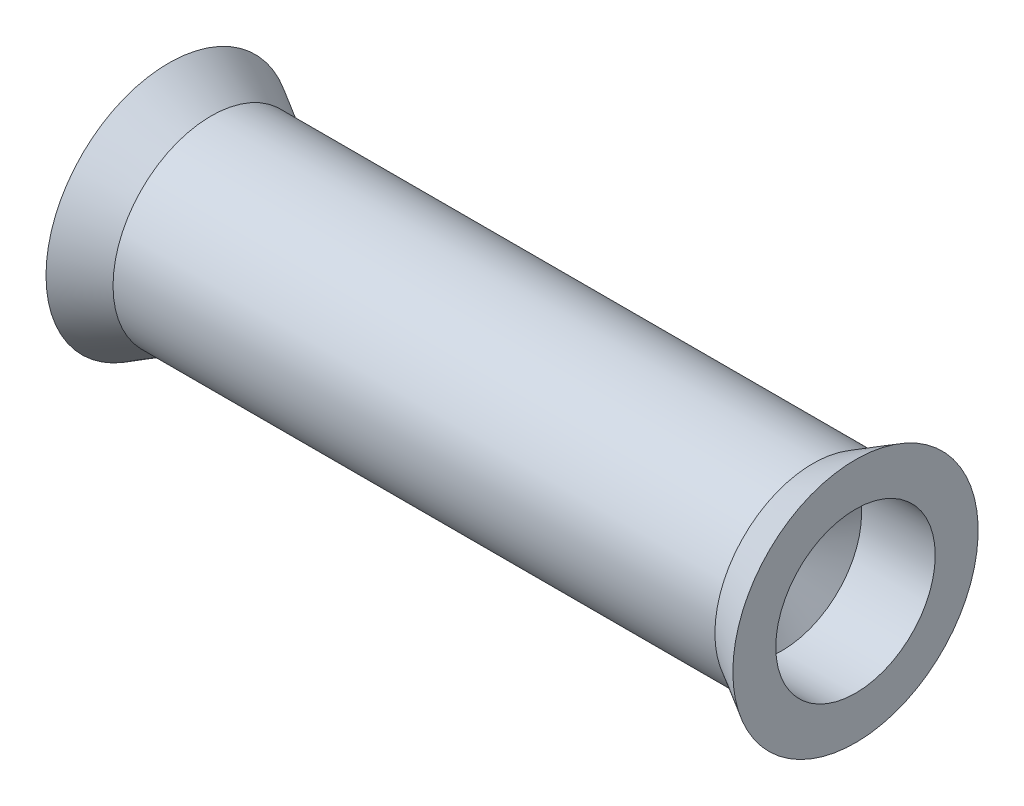
ISO-10303-21;
HEADER;
FILE_DESCRIPTION(('STEP AP214'),'2;1');
FILE_NAME('part.step','',(''),(''),'','','');
FILE_SCHEMA(('AUTOMOTIVE_DESIGN { 1 0 10303 214 1 1 1 1 }'));
ENDSEC;
DATA;
#1=APPLICATION_CONTEXT('core data for automotive mechanical design processes');
#2=APPLICATION_PROTOCOL_DEFINITION('international standard','automotive_design',2000,#1);
#3=PRODUCT_CONTEXT('',#1,'mechanical');
#4=PRODUCT('Part','Part','',(#3));
#5=PRODUCT_RELATED_PRODUCT_CATEGORY('part','',(#4));
#6=PRODUCT_DEFINITION_FORMATION('','',#4);
#7=PRODUCT_DEFINITION_CONTEXT('part definition',#1,'design');
#8=PRODUCT_DEFINITION('design','',#6,#7);
#9=PRODUCT_DEFINITION_SHAPE('','',#8);
#10=(LENGTH_UNIT() NAMED_UNIT(*) SI_UNIT(.MILLI.,.METRE.));
#11=(NAMED_UNIT(*) PLANE_ANGLE_UNIT() SI_UNIT($,.RADIAN.));
#12=(NAMED_UNIT(*) SI_UNIT($,.STERADIAN.) SOLID_ANGLE_UNIT());
#13=UNCERTAINTY_MEASURE_WITH_UNIT(LENGTH_MEASURE(1.E-05),#10,'distance_accuracy_value','');
#14=(GEOMETRIC_REPRESENTATION_CONTEXT(3) GLOBAL_UNCERTAINTY_ASSIGNED_CONTEXT((#13)) GLOBAL_UNIT_ASSIGNED_CONTEXT((#10,
#11,#12)) REPRESENTATION_CONTEXT('',''));
#15=CARTESIAN_POINT('',(0.,0.,0.));
#16=DIRECTION('',(0.,0.,1.));
#17=DIRECTION('',(1.,0.,0.));
#18=AXIS2_PLACEMENT_3D('',#15,#16,#17);
#19=CARTESIAN_POINT('',(-30.,0.,0.));
#20=DIRECTION('',(-1.,0.,0.));
#21=DIRECTION('',(0.,0.,1.));
#22=AXIS2_PLACEMENT_3D('',#19,#20,#21);
#23=CYLINDRICAL_SURFACE('',#22,4.);
#24=CARTESIAN_POINT('',(-12.2679491924311,0.,0.));
#25=DIRECTION('',(-1.,0.,0.));
#26=DIRECTION('',(0.,0.,1.));
#27=AXIS2_PLACEMENT_3D('',#24,#25,#26);
#28=CIRCLE('',#27,4.);
#29=CARTESIAN_POINT('',(-12.2679491924311,0.,4.));
#30=VERTEX_POINT('',#29);
#31=EDGE_CURVE('E54',#30,#30,#28,.T.);
#32=ORIENTED_EDGE('',*,*,#31,.F.);
#33=EDGE_LOOP('',(#32));
#34=FACE_BOUND('',#33,.T.);
#35=CARTESIAN_POINT('',(12.2679491924311,0.,0.));
#36=DIRECTION('',(1.,0.,0.));
#37=DIRECTION('',(0.,0.,-1.));
#38=AXIS2_PLACEMENT_3D('',#35,#36,#37);
#39=CIRCLE('',#38,4.);
#40=CARTESIAN_POINT('',(12.2679491924311,0.,-4.));
#41=VERTEX_POINT('',#40);
#42=EDGE_CURVE('E11',#41,#41,#39,.T.);
#43=ORIENTED_EDGE('',*,*,#42,.F.);
#44=EDGE_LOOP('',(#43));
#45=FACE_BOUND('',#44,.T.);
#46=ADVANCED_FACE('F45',(#34,#45),#23,.T.);
#47=CARTESIAN_POINT('',(-12.2679491924311,0.,0.));
#48=DIRECTION('',(-1.,0.,0.));
#49=DIRECTION('',(0.,0.,1.));
#50=AXIS2_PLACEMENT_3D('',#47,#48,#49);
#51=CONICAL_SURFACE('',#50,4.,0.5235987755983);
#52=CARTESIAN_POINT('',(-14.,0.,0.));
#53=DIRECTION('',(-1.,0.,0.));
#54=DIRECTION('',(0.,0.,1.));
#55=AXIS2_PLACEMENT_3D('',#52,#53,#54);
#56=CIRCLE('',#55,5.);
#57=CARTESIAN_POINT('',(-14.,0.,5.));
#58=VERTEX_POINT('',#57);
#59=EDGE_CURVE('E84',#58,#58,#56,.T.);
#60=ORIENTED_EDGE('',*,*,#59,.F.);
#61=EDGE_LOOP('',(#60));
#62=FACE_BOUND('',#61,.T.);
#63=ORIENTED_EDGE('',*,*,#31,.T.);
#64=EDGE_LOOP('',(#63));
#65=FACE_BOUND('',#64,.T.);
#66=ADVANCED_FACE('F113',(#62,#65),#51,.T.);
#67=CARTESIAN_POINT('',(-14.,0.,0.));
#68=DIRECTION('',(-1.,0.,0.));
#69=DIRECTION('',(0.,0.,1.));
#70=AXIS2_PLACEMENT_3D('',#67,#68,#69);
#71=PLANE('',#70);
#72=CARTESIAN_POINT('',(-14.,0.,0.));
#73=DIRECTION('',(-1.,0.,0.));
#74=DIRECTION('',(0.,0.,1.));
#75=AXIS2_PLACEMENT_3D('',#72,#73,#74);
#76=CIRCLE('',#75,3.25);
#77=CARTESIAN_POINT('',(-14.,0.,3.25));
#78=VERTEX_POINT('',#77);
#79=EDGE_CURVE('E79',#78,#78,#76,.F.);
#80=ORIENTED_EDGE('',*,*,#79,.T.);
#81=EDGE_LOOP('',(#80));
#82=FACE_BOUND('',#81,.T.);
#83=ORIENTED_EDGE('',*,*,#59,.T.);
#84=EDGE_LOOP('',(#83));
#85=FACE_BOUND('',#84,.T.);
#86=ADVANCED_FACE('F94',(#82,#85),#71,.T.);
#87=CARTESIAN_POINT('',(14.,0.,0.));
#88=DIRECTION('',(1.,0.,0.));
#89=DIRECTION('',(0.,0.,-1.));
#90=AXIS2_PLACEMENT_3D('',#87,#88,#89);
#91=CONICAL_SURFACE('',#90,5.,0.5235987755983);
#92=ORIENTED_EDGE('',*,*,#42,.T.);
#93=EDGE_LOOP('',(#92));
#94=FACE_BOUND('',#93,.T.);
#95=CARTESIAN_POINT('',(14.,0.,0.));
#96=DIRECTION('',(-1.,0.,0.));
#97=DIRECTION('',(0.,0.,1.));
#98=AXIS2_PLACEMENT_3D('',#95,#96,#97);
#99=CIRCLE('',#98,5.);
#100=CARTESIAN_POINT('',(14.,0.,5.));
#101=VERTEX_POINT('',#100);
#102=EDGE_CURVE('E80',#101,#101,#99,.T.);
#103=ORIENTED_EDGE('',*,*,#102,.T.);
#104=EDGE_LOOP('',(#103));
#105=FACE_BOUND('',#104,.T.);
#106=ADVANCED_FACE('F124',(#94,#105),#91,.T.);
#107=CARTESIAN_POINT('',(14.,0.,0.));
#108=DIRECTION('',(1.,0.,0.));
#109=DIRECTION('',(0.,0.,-1.));
#110=AXIS2_PLACEMENT_3D('',#107,#108,#109);
#111=PLANE('',#110);
#112=CARTESIAN_POINT('',(14.,0.,0.));
#113=DIRECTION('',(1.,0.,0.));
#114=DIRECTION('',(0.,0.,-1.));
#115=AXIS2_PLACEMENT_3D('',#112,#113,#114);
#116=CIRCLE('',#115,3.25);
#117=CARTESIAN_POINT('',(14.,0.,-3.25));
#118=VERTEX_POINT('',#117);
#119=EDGE_CURVE('E48',#118,#118,#116,.F.);
#120=ORIENTED_EDGE('',*,*,#119,.T.);
#121=EDGE_LOOP('',(#120));
#122=FACE_BOUND('',#121,.T.);
#123=ORIENTED_EDGE('',*,*,#102,.F.);
#124=EDGE_LOOP('',(#123));
#125=FACE_BOUND('',#124,.T.);
#126=ADVANCED_FACE('F101',(#122,#125),#111,.T.);
#127=CARTESIAN_POINT('',(-22.,0.,0.));
#128=DIRECTION('',(-1.,0.,0.));
#129=DIRECTION('',(0.,0.,1.));
#130=AXIS2_PLACEMENT_3D('',#127,#128,#129);
#131=CYLINDRICAL_SURFACE('',#130,3.25);
#132=ORIENTED_EDGE('',*,*,#79,.F.);
#133=EDGE_LOOP('',(#132));
#134=FACE_BOUND('',#133,.T.);
#135=CARTESIAN_POINT('',(-11.,0.,0.));
#136=DIRECTION('',(-1.,0.,0.));
#137=DIRECTION('',(0.,0.,1.));
#138=AXIS2_PLACEMENT_3D('',#135,#136,#137);
#139=CIRCLE('',#138,3.25);
#140=CARTESIAN_POINT('',(-11.,0.,3.25));
#141=VERTEX_POINT('',#140);
#142=EDGE_CURVE('E74',#141,#141,#139,.T.);
#143=ORIENTED_EDGE('',*,*,#142,.F.);
#144=EDGE_LOOP('',(#143));
#145=FACE_BOUND('',#144,.T.);
#146=ADVANCED_FACE('F97',(#134,#145),#131,.F.);
#147=CARTESIAN_POINT('',(-9.12361162513373,0.,0.));
#148=DIRECTION('',(-1.,0.,0.));
#149=DIRECTION('',(0.,0.,1.));
#150=AXIS2_PLACEMENT_3D('',#147,#148,#149);
#151=CONICAL_SURFACE('',#150,0.,1.0471975511966);
#152=ORIENTED_EDGE('',*,*,#142,.T.);
#153=EDGE_LOOP('',(#152));
#154=FACE_BOUND('',#153,.T.);
#155=CARTESIAN_POINT('',(-9.12361162513373,0.,0.));
#156=VERTEX_POINT('',#155);
#157=VERTEX_LOOP('',#156);
#158=FACE_BOUND('',#157,.T.);
#159=ADVANCED_FACE('F100',(#154,#158),#151,.F.);
#160=CARTESIAN_POINT('',(-22.,0.,0.));
#161=DIRECTION('',(-1.,0.,0.));
#162=DIRECTION('',(0.,0.,1.));
#163=AXIS2_PLACEMENT_3D('',#160,#161,#162);
#164=CYLINDRICAL_SURFACE('',#163,3.25);
#165=ORIENTED_EDGE('',*,*,#119,.F.);
#166=EDGE_LOOP('',(#165));
#167=FACE_BOUND('',#166,.T.);
#168=CARTESIAN_POINT('',(11.,0.,0.));
#169=DIRECTION('',(-1.,0.,0.));
#170=DIRECTION('',(0.,0.,1.));
#171=AXIS2_PLACEMENT_3D('',#168,#169,#170);
#172=CIRCLE('',#171,3.25);
#173=CARTESIAN_POINT('',(11.,0.,3.25));
#174=VERTEX_POINT('',#173);
#175=EDGE_CURVE('E68',#174,#174,#172,.T.);
#176=ORIENTED_EDGE('',*,*,#175,.T.);
#177=EDGE_LOOP('',(#176));
#178=FACE_BOUND('',#177,.T.);
#179=ADVANCED_FACE('F64',(#167,#178),#164,.F.);
#180=CARTESIAN_POINT('',(11.,0.,0.));
#181=DIRECTION('',(1.,0.,0.));
#182=DIRECTION('',(0.,0.,-1.));
#183=AXIS2_PLACEMENT_3D('',#180,#181,#182);
#184=CONICAL_SURFACE('',#183,3.25,1.0471975511966);
#185=CARTESIAN_POINT('',(9.12361162513373,0.,0.));
#186=VERTEX_POINT('',#185);
#187=VERTEX_LOOP('',#186);
#188=FACE_BOUND('',#187,.T.);
#189=ORIENTED_EDGE('',*,*,#175,.F.);
#190=EDGE_LOOP('',(#189));
#191=FACE_BOUND('',#190,.T.);
#192=ADVANCED_FACE('F61',(#188,#191),#184,.F.);
#193=CLOSED_SHELL('',(#46,#66,#86,#106,#126,#146,#159,#179,#192));
#194=MANIFOLD_SOLID_BREP('B2',#193);
#195=ADVANCED_BREP_SHAPE_REPRESENTATION('',(#18,#194),#14);
#196=SHAPE_DEFINITION_REPRESENTATION(#9,#195);
ENDSEC;
END-ISO-10303-21;
